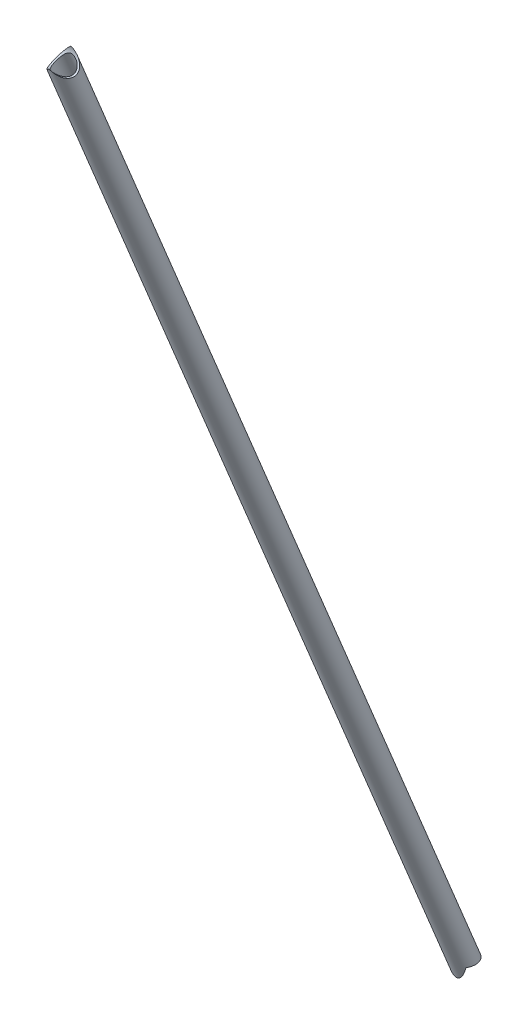
ISO-10303-21;
HEADER;
FILE_DESCRIPTION(('STEP AP214'),'2;1');
FILE_NAME('part.step','',(''),(''),'','','');
FILE_SCHEMA(('AUTOMOTIVE_DESIGN { 1 0 10303 214 1 1 1 1 }'));
ENDSEC;
DATA;
#1=APPLICATION_CONTEXT('core data for automotive mechanical design processes');
#2=APPLICATION_PROTOCOL_DEFINITION('international standard','automotive_design',2000,#1);
#3=PRODUCT_CONTEXT('',#1,'mechanical');
#4=PRODUCT('Part','Part','',(#3));
#5=PRODUCT_RELATED_PRODUCT_CATEGORY('part','',(#4));
#6=PRODUCT_DEFINITION_FORMATION('','',#4);
#7=PRODUCT_DEFINITION_CONTEXT('part definition',#1,'design');
#8=PRODUCT_DEFINITION('design','',#6,#7);
#9=PRODUCT_DEFINITION_SHAPE('','',#8);
#10=(LENGTH_UNIT() NAMED_UNIT(*) SI_UNIT(.MILLI.,.METRE.));
#11=(NAMED_UNIT(*) PLANE_ANGLE_UNIT() SI_UNIT($,.RADIAN.));
#12=(NAMED_UNIT(*) SI_UNIT($,.STERADIAN.) SOLID_ANGLE_UNIT());
#13=UNCERTAINTY_MEASURE_WITH_UNIT(LENGTH_MEASURE(1.E-05),#10,'distance_accuracy_value','');
#14=(GEOMETRIC_REPRESENTATION_CONTEXT(3) GLOBAL_UNCERTAINTY_ASSIGNED_CONTEXT((#13)) GLOBAL_UNIT_ASSIGNED_CONTEXT((#10,
#11,#12)) REPRESENTATION_CONTEXT('',''));
#15=CARTESIAN_POINT('',(0.,0.,0.));
#16=DIRECTION('',(0.,0.,1.));
#17=DIRECTION('',(1.,0.,0.));
#18=AXIS2_PLACEMENT_3D('',#15,#16,#17);
#19=CARTESIAN_POINT('',(250.,210.,-2290.));
#20=DIRECTION('',(0.,0.,-1.));
#21=DIRECTION('',(-1.,0.,0.));
#22=AXIS2_PLACEMENT_3D('',#19,#20,#21);
#23=PLANE('',#22);
#24=DIRECTION('',(-1.,0.,0.));
#25=VECTOR('',#24,1.);
#26=CARTESIAN_POINT('',(250.,230.,-2290.));
#27=LINE('',#26,#25);
#28=CARTESIAN_POINT('',(7.7857355411953,230.,-2290.));
#29=VERTEX_POINT('',#28);
#30=CARTESIAN_POINT('',(5.72517929129149,230.,-2290.));
#31=VERTEX_POINT('',#30);
#32=EDGE_CURVE('E52',#29,#31,#27,.T.);
#33=ORIENTED_EDGE('',*,*,#32,.F.);
#34=CARTESIAN_POINT('',(-1.11022302462516E-13,244.30832273917,-2290.));
#35=DIRECTION('',(0.,0.,-1.));
#36=DIRECTION('',(0.,1.,0.));
#37=AXIS2_PLACEMENT_3D('',#34,#35,#36);
#38=ELLIPSE('',#37,24.9706294541899,9.49999999999999);
#39=CARTESIAN_POINT('',(-7.78573554119555,230.,-2290.));
#40=VERTEX_POINT('',#39);
#41=EDGE_CURVE('E46',#29,#40,#38,.T.);
#42=ORIENTED_EDGE('',*,*,#41,.T.);
#43=CARTESIAN_POINT('',(-5.72517929129168,230.,-2290.));
#44=VERTEX_POINT('',#43);
#45=EDGE_CURVE('E11',#44,#40,#27,.T.);
#46=ORIENTED_EDGE('',*,*,#45,.F.);
#47=CARTESIAN_POINT('',(-1.11022302462516E-13,244.30832273917,-2290.));
#48=DIRECTION('',(0.,0.,-1.));
#49=DIRECTION('',(0.,1.,0.));
#50=AXIS2_PLACEMENT_3D('',#47,#48,#49);
#51=ELLIPSE('',#50,20.7650497566422,7.90000000000002);
#52=EDGE_CURVE('E59',#31,#44,#51,.T.);
#53=ORIENTED_EDGE('',*,*,#52,.F.);
#54=EDGE_LOOP('',(#33,#42,#46,#53));
#55=FACE_BOUND('',#54,.T.);
#56=ADVANCED_FACE('F41',(#55),#23,.T.);
#57=CARTESIAN_POINT('',(-1.11022302462516E-13,220.,-2300.));
#58=DIRECTION('',(0.,0.924802742541058,0.380446957391614));
#59=DIRECTION('',(0.,-0.380446957391614,0.924802742541059));
#60=AXIS2_PLACEMENT_3D('',#57,#58,#59);
#61=CYLINDRICAL_SURFACE('',#60,9.49999999999999);
#62=ORIENTED_EDGE('',*,*,#41,.F.);
#63=CARTESIAN_POINT('',(-1.11022302462516E-13,230.,-2295.88618264316));
#64=DIRECTION('',(0.,-1.,0.));
#65=DIRECTION('',(0.,0.,1.));
#66=AXIS2_PLACEMENT_3D('',#63,#64,#65);
#67=ELLIPSE('',#66,10.2724608859799,9.49999999999999);
#68=EDGE_CURVE('E80',#40,#29,#67,.T.);
#69=ORIENTED_EDGE('',*,*,#68,.F.);
#70=EDGE_LOOP('',(#62,#69));
#71=FACE_BOUND('',#70,.T.);
#72=CARTESIAN_POINT('',(-1.17642485907777E-13,1020.0613902972,-1981.14181749198));
#73=CARTESIAN_POINT('',(-0.00476395570826617,1020.05709000617,-1981.14358655171));
#74=CARTESIAN_POINT('',(-0.00952783543387543,1020.05278822485,-1981.14535235117));
#75=CARTESIAN_POINT('',(-0.381255036163503,1019.71699706261,-1981.2828861211));
#76=CARTESIAN_POINT('',(-0.747747319749148,1019.37668284663,-1981.39930584466));
#77=CARTESIAN_POINT('',(-1.47696524023888,1018.68070750712,-1981.59267044612));
#78=CARTESIAN_POINT('',(-1.83968759138233,1018.32503419514,-1981.66958332468));
#79=CARTESIAN_POINT('',(-2.55932794035052,1017.59972262505,-1981.78280455142));
#80=CARTESIAN_POINT('',(-2.91622948131538,1017.23005219277,-1981.81901263827));
#81=CARTESIAN_POINT('',(-3.62015639072642,1016.4799614229,-1981.84870088303));
#82=CARTESIAN_POINT('',(-3.96718655662807,1016.09954649267,-1981.84220216535));
#83=CARTESIAN_POINT('',(-4.55993175473336,1015.42992663756,-1981.79160048455));
#84=CARTESIAN_POINT('',(-4.8086385125098,1015.14257612515,-1981.75765714368));
#85=CARTESIAN_POINT('',(-5.29715445623769,1014.56450384117,-1981.66368074817));
#86=CARTESIAN_POINT('',(-5.53696350924695,1014.2737820193,-1981.60364730388));
#87=CARTESIAN_POINT('',(-6.00522173409664,1013.69108365541,-1981.45610599216));
#88=CARTESIAN_POINT('',(-6.2336921845568,1013.39911067445,-1981.36865203107));
#89=CARTESIAN_POINT('',(-6.67734258234318,1012.81532517662,-1981.16447051413));
#90=CARTESIAN_POINT('',(-6.8925270039673,1012.52351263889,-1981.04775288107));
#91=CARTESIAN_POINT('',(-7.24804389877152,1012.02481049319,-1980.82053319139));
#92=CARTESIAN_POINT('',(-7.39231958009247,1011.81726890523,-1980.71762755682));
#93=CARTESIAN_POINT('',(-7.67121032134468,1011.40479971782,-1980.49502335653));
#94=CARTESIAN_POINT('',(-7.80582585046948,1011.1998719918,-1980.37532560724));
#95=CARTESIAN_POINT('',(-8.1927322767359,1010.59146403502,-1979.99006879299));
#96=CARTESIAN_POINT('',(-8.42867281753812,1010.19353696711,-1979.69798271592));
#97=CARTESIAN_POINT('',(-8.79620707671721,1009.51316507807,-1979.1113163002));
#98=CARTESIAN_POINT('',(-8.93933674356415,1009.22451108519,-1978.83128309251));
#99=CARTESIAN_POINT('',(-9.12080931803952,1008.81404731683,-1978.37783656929));
#100=CARTESIAN_POINT('',(-9.17576738593604,1008.68096559445,-1978.22110262177));
#101=CARTESIAN_POINT('',(-9.27365235181239,1008.42368601369,-1977.89687404629));
#102=CARTESIAN_POINT('',(-9.31657912261504,1008.29948824923,-1977.7293793046));
#103=CARTESIAN_POINT('',(-9.38978149825218,1008.06050296694,-1977.38294667484));
#104=CARTESIAN_POINT('',(-9.41994531877897,1007.94580539855,-1977.20392288553));
#105=CARTESIAN_POINT('',(-9.46633234534266,1007.72853499548,-1976.83690695305));
#106=CARTESIAN_POINT('',(-9.48255554851918,1007.62596216327,-1976.64891480804));
#107=CARTESIAN_POINT('',(-9.50057432466105,1007.4343595692,-1976.2656127059));
#108=CARTESIAN_POINT('',(-9.50237841401433,1007.34532184356,-1976.07030713683));
#109=CARTESIAN_POINT('',(-9.49144336844887,1007.18179925203,-1975.67410426416));
#110=CARTESIAN_POINT('',(-9.47870591216852,1007.10731270754,-1975.47320760859));
#111=CARTESIAN_POINT('',(-9.44156030103364,1006.98240520692,-1975.09457112364));
#112=CARTESIAN_POINT('',(-9.41891310051538,1006.93010589109,-1974.91727200651));
#113=CARTESIAN_POINT('',(-9.36320932091083,1006.83716126507,-1974.56119989016));
#114=CARTESIAN_POINT('',(-9.33014939102955,1006.79651971437,-1974.38242643456));
#115=CARTESIAN_POINT('',(-9.25416759590408,1006.72688862347,-1974.0247744071));
#116=CARTESIAN_POINT('',(-9.21124837333435,1006.69789596662,-1973.8458958762));
#117=CARTESIAN_POINT('',(-9.11618165480177,1006.65128863406,-1973.48905219257));
#118=CARTESIAN_POINT('',(-9.06403046734815,1006.63367852292,-1973.31108743464));
#119=CARTESIAN_POINT('',(-8.94959484084403,1006.60908819483,-1972.95196833594));
#120=CARTESIAN_POINT('',(-8.88705953292382,1006.60243247214,-1972.77087203568));
#121=CARTESIAN_POINT('',(-8.75381113552691,1006.60016628898,-1972.41161588045));
#122=CARTESIAN_POINT('',(-8.68309544267337,1006.60455935403,-1972.23345698104));
#123=CARTESIAN_POINT('',(-8.45993591262923,1006.6333289551,-1971.70456599507));
#124=CARTESIAN_POINT('',(-8.29643620838007,1006.67328774508,-1971.35928598271));
#125=CARTESIAN_POINT('',(-7.84099180330615,1006.82390295964,-1970.48587929241));
#126=CARTESIAN_POINT('',(-7.53075873014381,1006.96256537947,-1969.97206745229));
#127=CARTESIAN_POINT('',(-7.03505461139341,1007.22359505716,-1969.2418157797));
#128=CARTESIAN_POINT('',(-6.8644275668957,1007.31966437434,-1969.00475449845));
#129=CARTESIAN_POINT('',(-6.51459999622415,1007.52749934419,-1968.54412887859));
#130=CARTESIAN_POINT('',(-6.33539968230144,1007.63926460842,-1968.32056420614));
#131=CARTESIAN_POINT('',(-5.8898768186919,1007.9285820066,-1967.79204532485));
#132=CARTESIAN_POINT('',(-5.61976745217472,1008.11350995272,-1967.49432256548));
#133=CARTESIAN_POINT('',(-5.06819594461503,1008.50741196227,-1966.92648143698));
#134=CARTESIAN_POINT('',(-4.78672841278842,1008.71639753317,-1966.65637639582));
#135=CARTESIAN_POINT('',(-4.21497139917116,1009.15486843348,-1966.14338718617));
#136=CARTESIAN_POINT('',(-3.92467912459483,1009.38436029808,-1965.90051175153));
#137=CARTESIAN_POINT('',(-3.33742831755242,1009.86088770957,-1965.4418308729));
#138=CARTESIAN_POINT('',(-3.0404716831271,1010.10791830365,-1965.22601783394));
#139=CARTESIAN_POINT('',(-2.51763030786597,1010.55251972091,-1964.87275760218));
#140=CARTESIAN_POINT('',(-2.29287055065371,1010.74669799501,-1964.72933624806));
#141=CARTESIAN_POINT('',(-1.84109767111739,1011.14278850368,-1964.45749203817));
#142=CARTESIAN_POINT('',(-1.61408416289283,1011.34470208029,-1964.32907180076));
#143=CARTESIAN_POINT('',(-0.931342842393494,1011.96023000636,-1963.96696892006));
#144=CARTESIAN_POINT('',(-0.472868704601314,1012.38452290439,-1963.75574020486));
#145=CARTESIAN_POINT('',(-0.00907152614211998,1012.82429347155,-1963.5741086899));
#146=CARTESIAN_POINT('',(-0.00453580008294922,1012.82859524557,-1963.57233550613));
#147=CARTESIAN_POINT('',(-1.04402119017255E-13,1012.83289810676,-1963.5705653837));
#148=B_SPLINE_CURVE_WITH_KNOTS('',3,(#72,#73,#74,#75,#76,#77,#78,#79,#80,#81,#82,#83,#84,#85,
#86,#87,#88,#89,#90,#91,#92,#93,#94,#95,#96,#97,#98,#99,#100,#101,#102,#103,#104,#105,#106,#107,
#108,#109,#110,#111,#112,#113,#114,#115,#116,#117,#118,#119,#120,#121,#122,#123,#124,#125,#126,
#127,#128,#129,#130,#131,#132,#133,#134,#135,#136,#137,#138,#139,#140,#141,#142,#143,#144,#145,
#146,#147),.UNSPECIFIED.,.F.,.F.,(4,2,2,2,2,2,2,2,2,2,2,2,2,2,2,2,2,2,2,2,2,2,2,2,2,2,2,2,2,2,2,
2,2,2,2,2,2,4),(0.,0.0199715072515686,1.55840966642414,3.09809195668663,4.64155843629194,
6.18426151590734,7.32800013647111,8.47175583896017,9.61327696864542,10.7544115508011,
11.5724595644916,12.3904678186649,14.0232898278451,15.2986221377068,15.9364279594462,
16.5742405228764,17.2175291954391,17.8608179999942,18.5037268295917,19.1465614509618,
19.7046067033659,20.2628317173796,20.8209072795744,21.3792064998416,21.9537642946825,
22.5285054460514,23.6775694424054,25.5146895859689,26.4365605665803,27.3584087359404,
28.6839500792176,30.010128122719,31.3367303258892,32.6629593846684,33.652014180829,
34.6412413543546,36.6150836770403,36.634577268172),.UNSPECIFIED.);
#149=CARTESIAN_POINT('',(-1.17642485907777E-13,1020.0613902972,-1981.14181749198));
#150=VERTEX_POINT('',#149);
#151=CARTESIAN_POINT('',(-1.04402119017255E-13,1012.83289810676,-1963.5705653837));
#152=VERTEX_POINT('',#151);
#153=EDGE_CURVE('E78',#150,#152,#148,.T.);
#154=ORIENTED_EDGE('',*,*,#153,.F.);
#155=CARTESIAN_POINT('',(-1.04402119017255E-13,1012.83289810676,-1963.5705653837));
#156=CARTESIAN_POINT('',(0.00453581686936943,1012.8285952288,-1963.57233551227));
#157=CARTESIAN_POINT('',(0.00907154281781286,1012.82429345489,-1963.57410869601));
#158=CARTESIAN_POINT('',(0.388769290678983,1012.46426568881,-1963.72280536111));
#159=CARTESIAN_POINT('',(0.76329256825881,1012.11611010264,-1963.89061966414));
#160=CARTESIAN_POINT('',(1.50859849300206,1011.43763202245,-1964.26677346287));
#161=CARTESIAN_POINT('',(1.87937772184525,1011.10732480413,-1964.47514699114));
#162=CARTESIAN_POINT('',(2.61538860736489,1010.46706594843,-1964.9322754242));
#163=CARTESIAN_POINT('',(2.98060628863123,1010.15716061963,-1965.18111802853));
#164=CARTESIAN_POINT('',(3.70170599964279,1009.56244630199,-1965.71872963358));
#165=CARTESIAN_POINT('',(4.05759363188169,1009.27762199833,-1966.00747398904));
#166=CARTESIAN_POINT('',(4.64186659538064,1008.82651355494,-1966.52390107074));
#167=CARTESIAN_POINT('',(4.87375114015529,1008.65201252572,-1966.74050689879));
#168=CARTESIAN_POINT('',(5.33051571951827,1008.31834220492,-1967.19223236397));
#169=CARTESIAN_POINT('',(5.55539580056998,1008.15917281163,-1967.42735187825));
#170=CARTESIAN_POINT('',(5.99604639983422,1007.85874898365,-1967.91582401976));
#171=CARTESIAN_POINT('',(6.21183411834037,1007.71745960674,-1968.16913951876));
#172=CARTESIAN_POINT('',(6.63267286841959,1007.45519387392,-1968.69451704131));
#173=CARTESIAN_POINT('',(6.8377273310716,1007.33421099904,-1968.96657300892));
#174=CARTESIAN_POINT('',(7.17952834736123,1007.14609567969,-1969.45136738616));
#175=CARTESIAN_POINT('',(7.31947003836745,1007.07332738976,-1969.6596772565));
#176=CARTESIAN_POINT('',(7.59114909632451,1006.94158804114,-1970.08584251734));
#177=CARTESIAN_POINT('',(7.72288680531076,1006.88261640696,-1970.30369750924));
#178=CARTESIAN_POINT('',(7.97659244353282,1006.78013161502,-1970.7483182993));
#179=CARTESIAN_POINT('',(8.09856887290642,1006.73660489182,-1970.97507608261));
#180=CARTESIAN_POINT('',(8.33117116506952,1006.666687743,-1971.43688416253));
#181=CARTESIAN_POINT('',(8.44180108366061,1006.64029117611,-1971.67193145541));
#182=CARTESIAN_POINT('',(8.62763614194002,1006.61001180286,-1972.09822067298));
#183=CARTESIAN_POINT('',(8.70536372213753,1006.60252744086,-1972.28811069456));
#184=CARTESIAN_POINT('',(8.85161256141856,1006.60008187332,-1972.67139731141));
#185=CARTESIAN_POINT('',(8.92013897411748,1006.60511362635,-1972.86479187429));
#186=CARTESIAN_POINT('',(9.04699600764672,1006.62842181725,-1973.25406414968));
#187=CARTESIAN_POINT('',(9.10532999679616,1006.64669386925,-1973.44994101882));
#188=CARTESIAN_POINT('',(9.21085047710213,1006.69704947369,-1973.84294588497));
#189=CARTESIAN_POINT('',(9.25803687044387,1006.72913314732,-1974.04007389294));
#190=CARTESIAN_POINT('',(9.34067449011244,1006.80771786785,-1974.43544520826));
#191=CARTESIAN_POINT('',(9.37604059111748,1006.85431901565,-1974.63368657438));
#192=CARTESIAN_POINT('',(9.43386782203959,1006.96187988985,-1975.02816107356));
#193=CARTESIAN_POINT('',(9.45632895165157,1007.0228396166,-1975.22439420657));
#194=CARTESIAN_POINT('',(9.4878957127579,1007.15875181925,-1975.61299208968));
#195=CARTESIAN_POINT('',(9.49700519105567,1007.23370025779,-1975.80535793824));
#196=CARTESIAN_POINT('',(9.50174279342943,1007.39689671937,-1976.1845215653));
#197=CARTESIAN_POINT('',(9.49737183990803,1007.48514383205,-1976.37131972389));
#198=CARTESIAN_POINT('',(9.4765284725595,1007.66371585775,-1976.71796649509));
#199=CARTESIAN_POINT('',(9.4614138302697,1007.75278732781,-1976.87854701846));
#200=CARTESIAN_POINT('',(9.42092731128635,1007.93986551149,-1977.19314681705));
#201=CARTESIAN_POINT('',(9.39555162909473,1008.03787552968,-1977.34716363455));
#202=CARTESIAN_POINT('',(9.33501290539603,1008.24184334692,-1977.64781360394));
#203=CARTESIAN_POINT('',(9.29985005942422,1008.34780098716,-1977.79444690328));
#204=CARTESIAN_POINT('',(9.22031185818247,1008.56669192559,-1978.07980793752));
#205=CARTESIAN_POINT('',(9.1759346192612,1008.67962664675,-1978.21853404859));
#206=CARTESIAN_POINT('',(9.06376306933344,1008.94684834538,-1978.52873594586));
#207=CARTESIAN_POINT('',(8.99295355272458,1009.10325101252,-1978.69731235516));
#208=CARTESIAN_POINT('',(8.83823377924057,1009.4242289696,-1979.01996687336));
#209=CARTESIAN_POINT('',(8.75432026432423,1009.58880628504,-1979.17404136135));
#210=CARTESIAN_POINT('',(8.4848400121795,1010.09256319511,-1979.61486837032));
#211=CARTESIAN_POINT('',(8.28162156689688,1010.44156228184,-1979.87999121192));
#212=CARTESIAN_POINT('',(7.90886671883229,1011.04107340826,-1980.2796095874));
#213=CARTESIAN_POINT('',(7.74884833700527,1011.288026362,-1980.42895995814));
#214=CARTESIAN_POINT('',(7.41448548783854,1011.78593013783,-1980.70296822689));
#215=CARTESIAN_POINT('',(7.2401417354246,1012.03688075991,-1980.82762735607));
#216=CARTESIAN_POINT('',(6.8791735157285,1012.54101082522,-1981.05372935779));
#217=CARTESIAN_POINT('',(6.69252896599868,1012.79419329782,-1981.15513299052));
#218=CARTESIAN_POINT('',(6.30913793642927,1013.30074057652,-1981.33578295018));
#219=CARTESIAN_POINT('',(6.1123914656923,1013.55410538246,-1981.41502929706));
#220=CARTESIAN_POINT('',(5.63578332039382,1014.15356567847,-1981.57807911522));
#221=CARTESIAN_POINT('',(5.35216261816164,1014.4991964253,-1981.65266889824));
#222=CARTESIAN_POINT('',(4.77224677903255,1015.18584756402,-1981.76507423702));
#223=CARTESIAN_POINT('',(4.47594640480541,1015.52686597275,-1981.80287444079));
#224=CARTESIAN_POINT('',(3.87354050634408,1016.20210425288,-1981.84375874647));
#225=CARTESIAN_POINT('',(3.56743657451721,1016.53632521414,-1981.84684845807));
#226=CARTESIAN_POINT('',(2.94782983629884,1017.19618639301,-1981.81996147379));
#227=CARTESIAN_POINT('',(2.63432965313485,1017.52182956869,-1981.78999633394));
#228=CARTESIAN_POINT('',(1.93951130656879,1018.22637856061,-1981.6892046632));
#229=CARTESIAN_POINT('',(1.55700498912956,1018.60313201166,-1981.61148856153));
#230=CARTESIAN_POINT('',(0.787930704437451,1019.33934246999,-1981.41201482926));
#231=CARTESIAN_POINT('',(0.401370291037111,1019.69882641814,-1981.29032850021));
#232=CARTESIAN_POINT('',(0.00952783454220981,1020.05278822559,-1981.14535235058));
#233=CARTESIAN_POINT('',(0.00476395482621184,1020.05709000689,-1981.14358655111));
#234=CARTESIAN_POINT('',(-1.17642485907777E-13,1020.0613902972,-1981.14181749198));
#235=B_SPLINE_CURVE_WITH_KNOTS('',3,(#155,#156,#157,#158,#159,#160,#161,#162,#163,#164,#165,
#166,#167,#168,#169,#170,#171,#172,#173,#174,#175,#176,#177,#178,#179,#180,#181,#182,#183,#184,
#185,#186,#187,#188,#189,#190,#191,#192,#193,#194,#195,#196,#197,#198,#199,#200,#201,#202,#203,
#204,#205,#206,#207,#208,#209,#210,#211,#212,#213,#214,#215,#216,#217,#218,#219,#220,#221,#222,
#223,#224,#225,#226,#227,#228,#229,#230,#231,#232,#233,#234),.UNSPECIFIED.,.F.,.F.,(4,2,2,2,2,2,
2,2,2,2,2,2,2,2,2,2,2,2,2,2,2,2,2,2,2,2,2,2,2,2,2,2,2,2,2,2,2,2,2,4),(0.,0.0194935911314602,
1.63189423518892,3.24565369566313,4.86295807153246,6.47926795036105,7.56491427978716,
8.65055340615771,9.73403702495832,10.8171721464976,11.6004576236209,12.3837104225902,
13.1662735690815,13.948556006869,14.5639545044599,15.1790068637953,15.7938555790038,
16.4087096890137,17.027900856452,17.6470920385293,18.2661047875987,18.8850751814736,
19.4372047902776,19.989539354728,20.5418628850166,21.0942994353441,21.8150482631466,
22.5359765765572,23.9787902979826,24.9676761363445,25.9565126530464,26.947005588716,
27.93749763189,29.295404424777,30.6538776186779,32.0121312617227,33.3699102075756,
34.9953021781969,36.6180701762627,36.6380416835144),.UNSPECIFIED.);
#236=EDGE_CURVE('E75',#152,#150,#235,.T.);
#237=ORIENTED_EDGE('',*,*,#236,.F.);
#238=EDGE_LOOP('',(#154,#237));
#239=FACE_BOUND('',#238,.T.);
#240=ADVANCED_FACE('F43',(#71,#239),#61,.T.);
#241=CARTESIAN_POINT('',(-1.11022302462516E-13,220.,-2300.));
#242=DIRECTION('',(0.,0.924802742541058,0.380446957391614));
#243=DIRECTION('',(0.,-0.380446957391614,0.924802742541059));
#244=AXIS2_PLACEMENT_3D('',#241,#242,#243);
#245=CYLINDRICAL_SURFACE('',#244,7.90000000000002);
#246=ORIENTED_EDGE('',*,*,#52,.T.);
#247=CARTESIAN_POINT('',(-1.11022302462516E-13,230.,-2295.88618264316));
#248=DIRECTION('',(0.,-1.,0.));
#249=DIRECTION('',(0.,0.,1.));
#250=AXIS2_PLACEMENT_3D('',#247,#248,#249);
#251=ELLIPSE('',#250,8.5423622104465,7.90000000000002);
#252=EDGE_CURVE('E82',#44,#31,#251,.T.);
#253=ORIENTED_EDGE('',*,*,#252,.T.);
#254=EDGE_LOOP('',(#246,#253));
#255=FACE_BOUND('',#254,.T.);
#256=CARTESIAN_POINT('',(-7.64983291650197,1006.87151346065,-1974.1627358401));
#257=CARTESIAN_POINT('',(-7.59710919517666,1006.83333119217,-1973.95732905224));
#258=CARTESIAN_POINT('',(-7.53652173269282,1006.80290928375,-1973.75247266037));
#259=CARTESIAN_POINT('',(-7.40085800971901,1006.75692428404,-1973.34581702691));
#260=CARTESIAN_POINT('',(-7.32577124422756,1006.74137201498,-1973.14402011699));
#261=CARTESIAN_POINT('',(-7.16223010940748,1006.72412556058,-1972.74464656625));
#262=CARTESIAN_POINT('',(-7.07373750413679,1006.72247180382,-1972.5470839036));
#263=CARTESIAN_POINT('',(-6.8848990221636,1006.73189019619,-1972.15815941932));
#264=CARTESIAN_POINT('',(-6.78455502064259,1006.74296033449,-1971.96679662281));
#265=CARTESIAN_POINT('',(-6.46991711483378,1006.79290838981,-1971.40772937537));
#266=CARTESIAN_POINT('',(-6.23993994938225,1006.84837749886,-1971.05007440805));
#267=CARTESIAN_POINT('',(-5.86911432440993,1006.95694516842,-1970.53856404103));
#268=CARTESIAN_POINT('',(-5.741126750762,1006.99738776562,-1970.37214719566));
#269=CARTESIAN_POINT('',(-5.4769524479068,1007.08541206949,-1970.04793327616));
#270=CARTESIAN_POINT('',(-5.34076773015529,1007.13299202901,-1969.89013410536));
#271=CARTESIAN_POINT('',(-5.03050613978832,1007.24476901282,-1969.55074281042));
#272=CARTESIAN_POINT('',(-4.85456699094305,1007.31034128748,-1969.37130683144));
#273=CARTESIAN_POINT('',(-4.49128432248018,1007.44747325903,-1969.02671147623));
#274=CARTESIAN_POINT('',(-4.30393682384557,1007.51903504825,-1968.86155713035));
#275=CARTESIAN_POINT('',(-3.91775701620967,1007.66517794503,-1968.54698207416));
#276=CARTESIAN_POINT('',(-3.71893226695263,1007.73975705569,-1968.39755118629));
#277=CARTESIAN_POINT('',(-3.30912585397755,1007.88839684634,-1968.11633077676));
#278=CARTESIAN_POINT('',(-3.09815226638554,1007.96245783485,-1967.98452972471));
#279=CARTESIAN_POINT('',(-2.63506069517597,1008.11479561443,-1967.72575845927));
#280=CARTESIAN_POINT('',(-2.38113595841685,1008.19239502624,-1967.60157540147));
#281=CARTESIAN_POINT('',(-1.85570860235006,1008.33232873172,-1967.38593625312));
#282=CARTESIAN_POINT('',(-1.58424488564055,1008.39469543581,-1967.29441048332));
#283=CARTESIAN_POINT('',(-1.18822954162989,1008.46467820252,-1967.19387006398));
#284=CARTESIAN_POINT('',(-1.06981060552665,1008.48306724553,-1967.1677912356));
#285=CARTESIAN_POINT('',(-0.83082378299213,1008.51448020551,-1967.123558647));
#286=CARTESIAN_POINT('',(-0.710256954768507,1008.52750669216,-1967.10540109077));
#287=CARTESIAN_POINT('',(-0.467768325125586,1008.54756589219,-1967.07754681678));
#288=CARTESIAN_POINT('',(-0.345848001646906,1008.55460459529,-1967.06784164368));
#289=CARTESIAN_POINT('',(-0.101419236679754,1008.5623455288,-1967.05717237574));
#290=CARTESIAN_POINT('',(0.021089203552142,1008.56304777275,-1967.05620826225));
#291=CARTESIAN_POINT('',(0.265755062921484,1008.55807360311,-1967.06305875792));
#292=CARTESIAN_POINT('',(0.387912410558303,1008.5523959714,-1967.07087504356));
#293=CARTESIAN_POINT('',(0.630962757437119,1008.53496893949,-1967.09502272253));
#294=CARTESIAN_POINT('',(0.751855198685242,1008.52321696612,-1967.11135772454));
#295=CARTESIAN_POINT('',(1.11171193480206,1008.4796290224,-1967.17250563513));
#296=CARTESIAN_POINT('',(1.34770451728342,1008.4394652187,-1967.2294563091));
#297=CARTESIAN_POINT('',(1.75257038261399,1008.35484264981,-1967.3534626838));
#298=CARTESIAN_POINT('',(1.92400453984487,1008.31370483721,-1967.41484979033));
#299=CARTESIAN_POINT('',(2.25985294628215,1008.22507016983,-1967.55104069405));
#300=CARTESIAN_POINT('',(2.42426307484675,1008.17756964814,-1967.62585223641));
#301=CARTESIAN_POINT('',(2.74655206822046,1008.0784956628,-1967.78728917745));
#302=CARTESIAN_POINT('',(2.90440763443113,1008.02690929794,-1967.87395268027));
#303=CARTESIAN_POINT('',(3.21334720826846,1007.92182290742,-1968.05747689642));
#304=CARTESIAN_POINT('',(3.36443165579712,1007.86832300649,-1968.15433694594));
#305=CARTESIAN_POINT('',(3.74053355557474,1007.73194362329,-1968.41229221946));
#306=CARTESIAN_POINT('',(3.96116312170022,1007.64888109061,-1968.57971422836));
#307=CARTESIAN_POINT('',(4.38821373141053,1007.48696755513,-1968.93375353107));
#308=CARTESIAN_POINT('',(4.59462716167692,1007.40811881397,-1969.12038097878));
#309=CARTESIAN_POINT('',(4.9932253481899,1007.25862284421,-1969.5109512554));
#310=CARTESIAN_POINT('',(5.18542206010826,1007.18796869524,-1969.71487921813));
#311=CARTESIAN_POINT('',(5.55524644913734,1007.05827591912,-1970.13890143791));
#312=CARTESIAN_POINT('',(5.73288057780001,1006.99923213192,-1970.3589884533));
#313=CARTESIAN_POINT('',(6.03275271445897,1006.90810012466,-1970.76100773389));
#314=CARTESIAN_POINT('',(6.15823335294203,1006.87293714852,-1970.93983226907));
#315=CARTESIAN_POINT('',(6.39917279053906,1006.81282718438,-1971.30574067066));
#316=CARTESIAN_POINT('',(6.51463407347489,1006.7878776587,-1971.49282247262));
#317=CARTESIAN_POINT('',(6.73438391520266,1006.74968264983,-1971.87426597494));
#318=CARTESIAN_POINT('',(6.83868797807282,1006.73642073488,-1972.06861705304));
#319=CARTESIAN_POINT('',(7.03507655885847,1006.72297442713,-1972.46384800867));
#320=CARTESIAN_POINT('',(7.12716360849165,1006.7227873206,-1972.66472652274));
#321=CARTESIAN_POINT('',(7.28171478003122,1006.73548551415,-1973.03342854883));
#322=CARTESIAN_POINT('',(7.34649355720763,1006.74592051623,-1973.20036884165));
#323=CARTESIAN_POINT('',(7.46632111876631,1006.77688295015,-1973.5367734191));
#324=CARTESIAN_POINT('',(7.52137202973536,1006.79740817248,-1973.70623714328));
#325=CARTESIAN_POINT('',(7.62098474218885,1006.84900958287,-1974.04658195068));
#326=CARTESIAN_POINT('',(7.66555044130051,1006.8800818398,-1974.2174624827));
#327=CARTESIAN_POINT('',(7.74353822361267,1006.95305491346,-1974.5594728297));
#328=CARTESIAN_POINT('',(7.77696019191629,1006.99495584182,-1974.73060264725));
#329=CARTESIAN_POINT('',(7.83223762166366,1007.08984760692,-1975.07255475499));
#330=CARTESIAN_POINT('',(7.85403778203307,1007.14288982086,-1975.24337178723));
#331=CARTESIAN_POINT('',(7.88545914527838,1007.25971087504,-1975.58244126942));
#332=CARTESIAN_POINT('',(7.89508033637415,1007.32348972567,-1975.7506937169));
#333=CARTESIAN_POINT('',(7.90200035269746,1007.46127434269,-1976.08320809303));
#334=CARTESIAN_POINT('',(7.89929960595667,1007.53527975377,-1976.24747016009));
#335=CARTESIAN_POINT('',(7.88167269043178,1007.69276800462,-1976.57069915745));
#336=CARTESIAN_POINT('',(7.86674688695658,1007.77625056115,-1976.72966624583));
#337=CARTESIAN_POINT('',(7.82651904058751,1007.94533418697,-1977.02979427111));
#338=CARTESIAN_POINT('',(7.80205448222496,1008.03033517986,-1977.17140771493));
#339=CARTESIAN_POINT('',(7.74328383873004,1008.20685904144,-1977.4484554466));
#340=CARTESIAN_POINT('',(7.70897406465835,1008.29838434507,-1977.58388739621));
#341=CARTESIAN_POINT('',(7.63101025271167,1008.48703430368,-1977.84796299545));
#342=CARTESIAN_POINT('',(7.58735686577598,1008.58415856825,-1977.9766071172));
#343=CARTESIAN_POINT('',(7.49125060435696,1008.78313210648,-1978.2267690187));
#344=CARTESIAN_POINT('',(7.43879590794692,1008.88498235527,-1978.34828531592));
#345=CARTESIAN_POINT('',(7.3061713375748,1009.1282802972,-1978.62454231434));
#346=CARTESIAN_POINT('',(7.22267592284206,1009.2712925897,-1978.7763252342));
#347=CARTESIAN_POINT('',(7.04218773781571,1009.56228781582,-1979.06642790745));
#348=CARTESIAN_POINT('',(6.94519114174944,1009.7102721493,-1979.20474382581));
#349=CARTESIAN_POINT('',(6.6354284682928,1010.15956946361,-1979.60018628824));
#350=CARTESIAN_POINT('',(6.40406258468537,1010.46591129136,-1979.83745862131));
#351=CARTESIAN_POINT('',(5.99388850405387,1010.96468152025,-1980.18292291365));
#352=CARTESIAN_POINT('',(5.82741855701475,1011.15721448876,-1980.30634855504));
#353=CARTESIAN_POINT('',(5.47923780264924,1011.53971208527,-1980.53470334958));
#354=CARTESIAN_POINT('',(5.297521436322,1011.7296757469,-1980.63962571262));
#355=CARTESIAN_POINT('',(4.9196289630482,1012.1040051866,-1980.83205500364));
#356=CARTESIAN_POINT('',(4.72344883160101,1012.28836938633,-1980.91955705922));
#357=CARTESIAN_POINT('',(4.31686357354104,1012.64810489054,-1981.07828650776));
#358=CARTESIAN_POINT('',(4.10646442864093,1012.82347992269,-1981.14952068981));
#359=CARTESIAN_POINT('',(3.74087098748481,1013.10692288357,-1981.25646975544));
#360=CARTESIAN_POINT('',(3.5896019310358,1013.21854469408,-1981.2962505991));
#361=CARTESIAN_POINT('',(3.2800629432351,1013.4340247878,-1981.36920927901));
#362=CARTESIAN_POINT('',(3.12179295427782,1013.5378830071,-1981.40238706091));
#363=CARTESIAN_POINT('',(2.79831245482007,1013.7355298397,-1981.46242471513));
#364=CARTESIAN_POINT('',(2.63311621837784,1013.82933787047,-1981.48929689434));
#365=CARTESIAN_POINT('',(2.2954919387931,1014.00444975463,-1981.53712661804));
#366=CARTESIAN_POINT('',(2.12306667183113,1014.08575835323,-1981.55808640962));
#367=CARTESIAN_POINT('',(1.69595292171922,1014.26404568853,-1981.60215661044));
#368=CARTESIAN_POINT('',(1.4374311587079,1014.35301094352,-1981.62239900269));
#369=CARTESIAN_POINT('',(1.0414384200408,1014.45496162455,-1981.64478156909));
#370=CARTESIAN_POINT('',(0.908141145444029,1014.48368915024,-1981.65091118137));
#371=CARTESIAN_POINT('',(0.639508166238862,1014.52964505008,-1981.66059092894));
#372=CARTESIAN_POINT('',(0.504173490855898,1014.54687904341,-1981.66414232478));
#373=CARTESIAN_POINT('',(0.231513940846754,1014.56919417462,-1981.66872327033));
#374=CARTESIAN_POINT('',(0.0941817752141511,1014.57419044019,-1981.66973520931));
#375=CARTESIAN_POINT('',(-0.180353309329149,1014.57155798765,-1981.66919887476));
#376=CARTESIAN_POINT('',(-0.317556230601577,1014.56392950491,-1981.66765064896));
#377=CARTESIAN_POINT('',(-0.5907865621324,1014.53638127702,-1981.66197296899));
#378=CARTESIAN_POINT('',(-0.726812735064964,1014.51644988972,-1981.65784106986));
#379=CARTESIAN_POINT('',(-0.99662509051272,1014.46512081285,-1981.64694493922));
#380=CARTESIAN_POINT('',(-1.13040998259936,1014.43371674009,-1981.64017924218));
#381=CARTESIAN_POINT('',(-1.42820510603321,1014.35140627911,-1981.62190144671));
#382=CARTESIAN_POINT('',(-1.59136108731233,1014.29758206521,-1981.60962380153));
#383=CARTESIAN_POINT('',(-1.91213611191856,1014.17630163557,-1981.58064587893));
#384=CARTESIAN_POINT('',(-2.06975215726039,1014.10883816819,-1981.56394324739));
#385=CARTESIAN_POINT('',(-2.37948060108729,1013.96253231081,-1981.52585281665));
#386=CARTESIAN_POINT('',(-2.53157786278735,1013.88366120755,-1981.50445312232));
#387=CARTESIAN_POINT('',(-2.82981256095329,1013.7168039581,-1981.45676438516));
#388=CARTESIAN_POINT('',(-2.97595079314796,1013.6288190345,-1981.43047599775));
#389=CARTESIAN_POINT('',(-3.34342030297844,1013.39369111925,-1981.35644532803));
#390=CARTESIAN_POINT('',(-3.56059586497913,1013.24120579693,-1981.30497247903));
#391=CARTESIAN_POINT('',(-3.98154965341564,1012.92341607604,-1981.18843691808));
#392=CARTESIAN_POINT('',(-4.18532079901193,1012.75810500122,-1981.12336709818));
#393=CARTESIAN_POINT('',(-4.58006604973858,1012.41831441837,-1980.97854594497));
#394=CARTESIAN_POINT('',(-4.77102272956177,1012.24382297944,-1980.89877515162));
#395=CARTESIAN_POINT('',(-5.13977898202632,1011.88896669929,-1980.72359953271));
#396=CARTESIAN_POINT('',(-5.31758106408277,1011.7086029878,-1980.6281977002));
#397=CARTESIAN_POINT('',(-5.66469457123296,1011.33916194162,-1980.41761720138));
#398=CARTESIAN_POINT('',(-5.83359565189898,1011.14998505022,-1980.30193432892));
#399=CARTESIAN_POINT('',(-6.15599287444972,1010.77080859049,-1980.05173872494));
#400=CARTESIAN_POINT('',(-6.30948598391491,1010.58080886787,-1979.91722229926));
#401=CARTESIAN_POINT('',(-6.59907723425753,1010.20335711541,-1979.6287957836));
#402=CARTESIAN_POINT('',(-6.73522284580775,1010.01589944448,-1979.47494101168));
#403=CARTESIAN_POINT('',(-6.98855704671341,1009.64611308162,-1979.14686692026));
#404=CARTESIAN_POINT('',(-7.10575688254087,1009.46378140033,-1978.9726597888));
#405=CARTESIAN_POINT('',(-7.28290683167324,1009.16772555611,-1978.66591518406));
#406=CARTESIAN_POINT('',(-7.34883911026983,1009.05158969124,-1978.53912208429));
#407=CARTESIAN_POINT('',(-7.47057847319664,1008.82418685923,-1978.27664387458));
#408=CARTESIAN_POINT('',(-7.52638842030221,1008.71291852223,-1978.14096129356));
#409=CARTESIAN_POINT('',(-7.62711929252973,1008.4964288904,-1977.86104694946));
#410=CARTESIAN_POINT('',(-7.6720432937937,1008.39120589372,-1977.7168176159));
#411=CARTESIAN_POINT('',(-7.75030707186986,1008.1879665929,-1977.42033394203));
#412=CARTESIAN_POINT('',(-7.78364677109348,1008.08995033704,-1977.26807954799));
#413=CARTESIAN_POINT('',(-7.83831522451572,1007.90165713449,-1976.95530650966));
#414=CARTESIAN_POINT('',(-7.85956027488524,1007.8114377025,-1976.7947384666));
#415=CARTESIAN_POINT('',(-7.88923641636039,1007.64058729742,-1976.46740387869));
#416=CARTESIAN_POINT('',(-7.89766637136804,1007.55995717503,-1976.30063678563));
#417=CARTESIAN_POINT('',(-7.9014883310454,1007.40931657502,-1975.96249307971));
#418=CARTESIAN_POINT('',(-7.89689781509122,1007.33929199296,-1975.79112295226));
#419=CARTESIAN_POINT('',(-7.87476600594349,1007.21042658682,-1975.44512905318));
#420=CARTESIAN_POINT('',(-7.85723037341579,1007.15158088857,-1975.27050673619));
#421=CARTESIAN_POINT('',(-7.81234938049678,1007.05168422669,-1974.94026712421));
#422=CARTESIAN_POINT('',(-7.78640825206149,1007.00935214863,-1974.78484269115));
#423=CARTESIAN_POINT('',(-7.72508562248812,1006.93370754422,-1974.47375241785));
#424=CARTESIAN_POINT('',(-7.68970830876819,1006.90039103028,-1974.31808671507));
#425=CARTESIAN_POINT('',(-7.64983291650197,1006.87151346065,-1974.1627358401));
#426=B_SPLINE_CURVE_WITH_KNOTS('',3,(#256,#257,#258,#259,#260,#261,#262,#263,#264,#265,#266,
#267,#268,#269,#270,#271,#272,#273,#274,#275,#276,#277,#278,#279,#280,#281,#282,#283,#284,#285,
#286,#287,#288,#289,#290,#291,#292,#293,#294,#295,#296,#297,#298,#299,#300,#301,#302,#303,#304,
#305,#306,#307,#308,#309,#310,#311,#312,#313,#314,#315,#316,#317,#318,#319,#320,#321,#322,#323,
#324,#325,#326,#327,#328,#329,#330,#331,#332,#333,#334,#335,#336,#337,#338,#339,#340,#341,#342,
#343,#344,#345,#346,#347,#348,#349,#350,#351,#352,#353,#354,#355,#356,#357,#358,#359,#360,#361,
#362,#363,#364,#365,#366,#367,#368,#369,#370,#371,#372,#373,#374,#375,#376,#377,#378,#379,#380,
#381,#382,#383,#384,#385,#386,#387,#388,#389,#390,#391,#392,#393,#394,#395,#396,#397,#398,#399,
#400,#401,#402,#403,#404,#405,#406,#407,#408,#409,#410,#411,#412,#413,#414,#415,#416,#417,#418,
#419,#420,#421,#422,#423,#424,#425),.UNSPECIFIED.,.T.,.F.,(4,2,2,2,2,2,2,2,2,2,2,2,2,2,2,2,2,2,
2,2,2,2,2,2,2,2,2,2,2,2,2,2,2,2,2,2,2,2,2,2,2,2,2,2,2,2,2,2,2,2,2,2,2,2,2,2,2,2,2,2,2,2,2,2,2,2,
2,2,2,2,2,2,2,2,2,2,2,2,2,2,2,2,2,2,4),(0.,0.646216301194339,1.29290256621765,1.94146929080848,
2.58993353337055,3.8708754957504,4.51197497650766,5.15291777741902,5.93133338277546,
6.71002205735555,7.48820355766044,8.26587359152132,9.14327434411052,10.0187916749264,
10.3863979185433,10.7538278041316,11.1208897072711,11.4879508264922,11.8550820418077,
12.2223689071234,12.9573907719451,13.5167342717615,14.0764015263358,14.6379123758604,
15.1993866924442,16.0656568913787,16.9323874626955,17.7983806614572,18.6639881088313,
19.3272457136816,19.990338422866,20.6524973886793,21.3145189209924,21.85211611604,
22.3895956423997,22.9268750567861,23.4641600105933,24.0039792570247,24.543799025597,
25.0836000423945,25.6233849294574,26.123744908205,26.6242926139934,27.1248054595844,
27.6254220426141,28.2983224883252,28.9714140006445,30.3190822546026,31.1668592769871,
32.0149467621483,32.8632711223074,33.7112408010933,34.2873708415039,34.863505623353,
35.4385064098274,36.0132883646651,36.8322119710299,37.2412651813086,37.6501182591405,
38.0617989264607,38.4734719190986,38.8855350735185,39.297827842209,39.8137424333485,
40.3299320473037,40.8474442923717,41.3648872045031,42.1746209679424,42.9847790915711,
43.7960174458735,44.6071006444617,45.4423297881326,46.2777229910271,47.1107787021988,
47.9433380696092,48.4952972491305,49.0471000805309,49.5987468016086,50.1503972173973,
50.7058204418104,51.2612929033453,51.8160200220355,52.3705047121482,52.8594601358356,
53.3481989397595),.UNSPECIFIED.);
#427=CARTESIAN_POINT('',(-7.64983291650197,1006.87151346065,-1974.1627358401));
#428=VERTEX_POINT('',#427);
#429=EDGE_CURVE('E85',#428,#428,#426,.T.);
#430=ORIENTED_EDGE('',*,*,#429,.T.);
#431=EDGE_LOOP('',(#430));
#432=FACE_BOUND('',#431,.T.);
#433=ADVANCED_FACE('F102',(#255,#432),#245,.F.);
#434=CARTESIAN_POINT('',(0.,904.255410655569,-1942.29450703663));
#435=DIRECTION('',(0.,0.258819045102518,0.965925826289069));
#436=DIRECTION('',(0.,-0.965925826289069,0.258819045102518));
#437=AXIS2_PLACEMENT_3D('',#434,#435,#436);
#438=TOROIDAL_SURFACE('',#437,116.149429379517,9.49999999999999);
#439=ORIENTED_EDGE('',*,*,#429,.F.);
#440=EDGE_LOOP('',(#439));
#441=FACE_BOUND('',#440,.T.);
#442=ORIENTED_EDGE('',*,*,#153,.T.);
#443=ORIENTED_EDGE('',*,*,#236,.T.);
#444=EDGE_LOOP('',(#442,#443));
#445=FACE_BOUND('',#444,.T.);
#446=ADVANCED_FACE('F77',(#441,#445),#438,.F.);
#447=CARTESIAN_POINT('',(250.,230.,-2310.));
#448=DIRECTION('',(0.,-1.,0.));
#449=DIRECTION('',(0.,0.,-1.));
#450=AXIS2_PLACEMENT_3D('',#447,#448,#449);
#451=PLANE('',#450);
#452=ORIENTED_EDGE('',*,*,#68,.T.);
#453=ORIENTED_EDGE('',*,*,#32,.T.);
#454=ORIENTED_EDGE('',*,*,#252,.F.);
#455=ORIENTED_EDGE('',*,*,#45,.T.);
#456=EDGE_LOOP('',(#452,#453,#454,#455));
#457=FACE_BOUND('',#456,.T.);
#458=ADVANCED_FACE('F101',(#457),#451,.T.);
#459=CLOSED_SHELL('',(#56,#240,#433,#446,#458));
#460=MANIFOLD_SOLID_BREP('B2',#459);
#461=ADVANCED_BREP_SHAPE_REPRESENTATION('',(#18,#460),#14);
#462=SHAPE_DEFINITION_REPRESENTATION(#9,#461);
ENDSEC;
END-ISO-10303-21;
